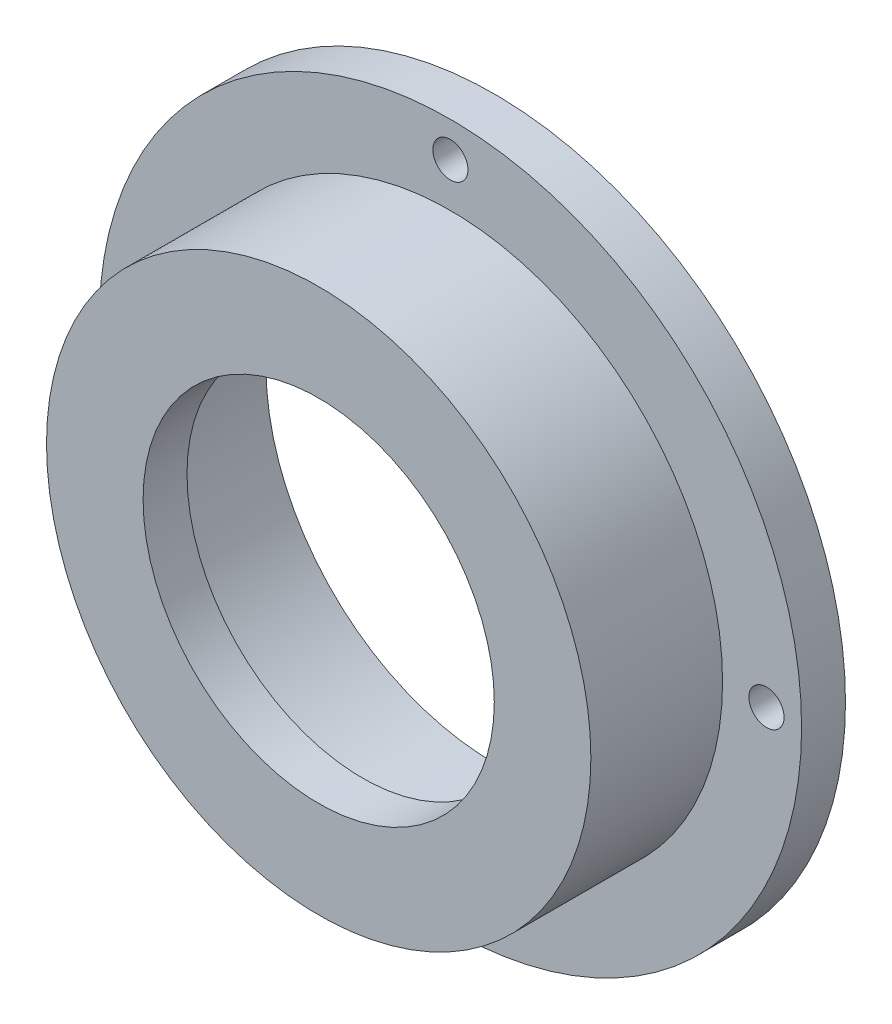
ISO-10303-21;
HEADER;
FILE_DESCRIPTION(('STEP AP214'),'2;1');
FILE_NAME('part.step','',(''),(''),'','','');
FILE_SCHEMA(('AUTOMOTIVE_DESIGN { 1 0 10303 214 1 1 1 1 }'));
ENDSEC;
DATA;
#1=APPLICATION_CONTEXT('core data for automotive mechanical design processes');
#2=APPLICATION_PROTOCOL_DEFINITION('international standard','automotive_design',2000,#1);
#3=PRODUCT_CONTEXT('',#1,'mechanical');
#4=PRODUCT('Part','Part','',(#3));
#5=PRODUCT_RELATED_PRODUCT_CATEGORY('part','',(#4));
#6=PRODUCT_DEFINITION_FORMATION('','',#4);
#7=PRODUCT_DEFINITION_CONTEXT('part definition',#1,'design');
#8=PRODUCT_DEFINITION('design','',#6,#7);
#9=PRODUCT_DEFINITION_SHAPE('','',#8);
#10=(LENGTH_UNIT() NAMED_UNIT(*) SI_UNIT(.MILLI.,.METRE.));
#11=(NAMED_UNIT(*) PLANE_ANGLE_UNIT() SI_UNIT($,.RADIAN.));
#12=(NAMED_UNIT(*) SI_UNIT($,.STERADIAN.) SOLID_ANGLE_UNIT());
#13=UNCERTAINTY_MEASURE_WITH_UNIT(LENGTH_MEASURE(1.E-05),#10,'distance_accuracy_value','');
#14=(GEOMETRIC_REPRESENTATION_CONTEXT(3) GLOBAL_UNCERTAINTY_ASSIGNED_CONTEXT((#13)) GLOBAL_UNIT_ASSIGNED_CONTEXT((#10,
#11,#12)) REPRESENTATION_CONTEXT('',''));
#15=CARTESIAN_POINT('',(0.,0.,0.));
#16=DIRECTION('',(0.,0.,1.));
#17=DIRECTION('',(1.,0.,0.));
#18=AXIS2_PLACEMENT_3D('',#15,#16,#17);
#19=CARTESIAN_POINT('',(0.,0.,5.));
#20=DIRECTION('',(0.,0.,-1.));
#21=DIRECTION('',(-1.,0.,0.));
#22=AXIS2_PLACEMENT_3D('',#19,#20,#21);
#23=CYLINDRICAL_SURFACE('',#22,40.);
#24=CARTESIAN_POINT('',(0.,0.,5.));
#25=DIRECTION('',(0.,0.,1.));
#26=DIRECTION('',(1.,0.,0.));
#27=AXIS2_PLACEMENT_3D('',#24,#25,#26);
#28=CIRCLE('',#27,40.);
#29=CARTESIAN_POINT('',(40.,0.,5.));
#30=VERTEX_POINT('',#29);
#31=EDGE_CURVE('E42',#30,#30,#28,.T.);
#32=ORIENTED_EDGE('',*,*,#31,.F.);
#33=EDGE_LOOP('',(#32));
#34=FACE_BOUND('',#33,.T.);
#35=CARTESIAN_POINT('',(0.,0.,0.));
#36=DIRECTION('',(0.,0.,1.));
#37=DIRECTION('',(1.,0.,0.));
#38=AXIS2_PLACEMENT_3D('',#35,#36,#37);
#39=CIRCLE('',#38,40.);
#40=CARTESIAN_POINT('',(40.,0.,0.));
#41=VERTEX_POINT('',#40);
#42=EDGE_CURVE('E38',#41,#41,#39,.T.);
#43=ORIENTED_EDGE('',*,*,#42,.T.);
#44=EDGE_LOOP('',(#43));
#45=FACE_BOUND('',#44,.T.);
#46=ADVANCED_FACE('F35',(#34,#45),#23,.T.);
#47=CARTESIAN_POINT('',(0.,0.,5.));
#48=DIRECTION('',(0.,0.,1.));
#49=DIRECTION('',(1.,0.,0.));
#50=AXIS2_PLACEMENT_3D('',#47,#48,#49);
#51=PLANE('',#50);
#52=CARTESIAN_POINT('',(36.,-1.25693328198353E-13,5.));
#53=DIRECTION('',(0.,0.,-1.));
#54=DIRECTION('',(0.,1.,0.));
#55=AXIS2_PLACEMENT_3D('',#52,#53,#54);
#56=CIRCLE('',#55,2.);
#57=CARTESIAN_POINT('',(36.,1.99999999999988,5.));
#58=VERTEX_POINT('',#57);
#59=EDGE_CURVE('E61',#58,#58,#56,.T.);
#60=ORIENTED_EDGE('',*,*,#59,.T.);
#61=EDGE_LOOP('',(#60));
#62=FACE_BOUND('',#61,.T.);
#63=CARTESIAN_POINT('',(0.,-36.,5.));
#64=DIRECTION('',(0.,0.,-1.));
#65=DIRECTION('',(1.,0.,0.));
#66=AXIS2_PLACEMENT_3D('',#63,#64,#65);
#67=CIRCLE('',#66,2.);
#68=CARTESIAN_POINT('',(2.,-36.,5.));
#69=VERTEX_POINT('',#68);
#70=EDGE_CURVE('E74',#69,#69,#67,.T.);
#71=ORIENTED_EDGE('',*,*,#70,.T.);
#72=EDGE_LOOP('',(#71));
#73=FACE_BOUND('',#72,.T.);
#74=CARTESIAN_POINT('',(-36.,3.77079984595058E-13,5.));
#75=DIRECTION('',(0.,0.,-1.));
#76=DIRECTION('',(0.,-1.,0.));
#77=AXIS2_PLACEMENT_3D('',#74,#75,#76);
#78=CIRCLE('',#77,2.);
#79=CARTESIAN_POINT('',(-36.,-1.99999999999963,5.));
#80=VERTEX_POINT('',#79);
#81=EDGE_CURVE('E67',#80,#80,#78,.T.);
#82=ORIENTED_EDGE('',*,*,#81,.T.);
#83=EDGE_LOOP('',(#82));
#84=FACE_BOUND('',#83,.T.);
#85=CARTESIAN_POINT('',(0.,36.,5.));
#86=DIRECTION('',(0.,0.,-1.));
#87=DIRECTION('',(-1.,0.,0.));
#88=AXIS2_PLACEMENT_3D('',#85,#86,#87);
#89=CIRCLE('',#88,2.);
#90=CARTESIAN_POINT('',(-2.,36.,5.));
#91=VERTEX_POINT('',#90);
#92=EDGE_CURVE('E57',#91,#91,#89,.T.);
#93=ORIENTED_EDGE('',*,*,#92,.T.);
#94=EDGE_LOOP('',(#93));
#95=FACE_BOUND('',#94,.T.);
#96=CARTESIAN_POINT('',(0.,0.,5.));
#97=DIRECTION('',(0.,0.,1.));
#98=DIRECTION('',(1.,0.,0.));
#99=AXIS2_PLACEMENT_3D('',#96,#97,#98);
#100=CIRCLE('',#99,31.);
#101=CARTESIAN_POINT('',(31.,0.,5.));
#102=VERTEX_POINT('',#101);
#103=EDGE_CURVE('E10',#102,#102,#100,.T.);
#104=ORIENTED_EDGE('',*,*,#103,.F.);
#105=EDGE_LOOP('',(#104));
#106=FACE_BOUND('',#105,.T.);
#107=ORIENTED_EDGE('',*,*,#31,.T.);
#108=EDGE_LOOP('',(#107));
#109=FACE_BOUND('',#108,.T.);
#110=ADVANCED_FACE('F109',(#62,#73,#84,#95,#106,#109),#51,.T.);
#111=CARTESIAN_POINT('',(0.,0.,0.));
#112=DIRECTION('',(0.,0.,1.));
#113=DIRECTION('',(1.,0.,0.));
#114=AXIS2_PLACEMENT_3D('',#111,#112,#113);
#115=PLANE('',#114);
#116=CARTESIAN_POINT('',(36.,-1.25693328198353E-13,0.));
#117=DIRECTION('',(0.,0.,-1.));
#118=DIRECTION('',(0.,1.,0.));
#119=AXIS2_PLACEMENT_3D('',#116,#117,#118);
#120=CIRCLE('',#119,2.);
#121=CARTESIAN_POINT('',(36.,1.99999999999988,0.));
#122=VERTEX_POINT('',#121);
#123=EDGE_CURVE('E77',#122,#122,#120,.T.);
#124=ORIENTED_EDGE('',*,*,#123,.F.);
#125=EDGE_LOOP('',(#124));
#126=FACE_BOUND('',#125,.T.);
#127=CARTESIAN_POINT('',(0.,-36.,0.));
#128=DIRECTION('',(0.,0.,-1.));
#129=DIRECTION('',(1.,0.,0.));
#130=AXIS2_PLACEMENT_3D('',#127,#128,#129);
#131=CIRCLE('',#130,2.);
#132=CARTESIAN_POINT('',(2.,-36.,0.));
#133=VERTEX_POINT('',#132);
#134=EDGE_CURVE('E71',#133,#133,#131,.T.);
#135=ORIENTED_EDGE('',*,*,#134,.F.);
#136=EDGE_LOOP('',(#135));
#137=FACE_BOUND('',#136,.T.);
#138=CARTESIAN_POINT('',(-36.,3.77079984595058E-13,0.));
#139=DIRECTION('',(0.,0.,-1.));
#140=DIRECTION('',(0.,-1.,0.));
#141=AXIS2_PLACEMENT_3D('',#138,#139,#140);
#142=CIRCLE('',#141,2.);
#143=CARTESIAN_POINT('',(-36.,-1.99999999999963,0.));
#144=VERTEX_POINT('',#143);
#145=EDGE_CURVE('E64',#144,#144,#142,.T.);
#146=ORIENTED_EDGE('',*,*,#145,.F.);
#147=EDGE_LOOP('',(#146));
#148=FACE_BOUND('',#147,.T.);
#149=CARTESIAN_POINT('',(0.,36.,0.));
#150=DIRECTION('',(0.,0.,-1.));
#151=DIRECTION('',(-1.,0.,0.));
#152=AXIS2_PLACEMENT_3D('',#149,#150,#151);
#153=CIRCLE('',#152,2.);
#154=CARTESIAN_POINT('',(-2.,36.,0.));
#155=VERTEX_POINT('',#154);
#156=EDGE_CURVE('E58',#155,#155,#153,.T.);
#157=ORIENTED_EDGE('',*,*,#156,.F.);
#158=EDGE_LOOP('',(#157));
#159=FACE_BOUND('',#158,.T.);
#160=CARTESIAN_POINT('',(0.,0.,0.));
#161=DIRECTION('',(0.,0.,-1.));
#162=DIRECTION('',(-1.,0.,0.));
#163=AXIS2_PLACEMENT_3D('',#160,#161,#162);
#164=CIRCLE('',#163,26.);
#165=CARTESIAN_POINT('',(-26.,0.,0.));
#166=VERTEX_POINT('',#165);
#167=EDGE_CURVE('E48',#166,#166,#164,.T.);
#168=ORIENTED_EDGE('',*,*,#167,.F.);
#169=EDGE_LOOP('',(#168));
#170=FACE_BOUND('',#169,.T.);
#171=ORIENTED_EDGE('',*,*,#42,.F.);
#172=EDGE_LOOP('',(#171));
#173=FACE_BOUND('',#172,.T.);
#174=ADVANCED_FACE('F101',(#126,#137,#148,#159,#170,#173),#115,.F.);
#175=CARTESIAN_POINT('',(0.,0.,17.));
#176=DIRECTION('',(0.,0.,-1.));
#177=DIRECTION('',(-1.,0.,0.));
#178=AXIS2_PLACEMENT_3D('',#175,#176,#177);
#179=CYLINDRICAL_SURFACE('',#178,31.);
#180=ORIENTED_EDGE('',*,*,#103,.T.);
#181=EDGE_LOOP('',(#180));
#182=FACE_BOUND('',#181,.T.);
#183=CARTESIAN_POINT('',(0.,0.,20.));
#184=DIRECTION('',(0.,0.,1.));
#185=DIRECTION('',(1.,0.,0.));
#186=AXIS2_PLACEMENT_3D('',#183,#184,#185);
#187=CIRCLE('',#186,31.);
#188=CARTESIAN_POINT('',(31.,0.,20.));
#189=VERTEX_POINT('',#188);
#190=EDGE_CURVE('E52',#189,#189,#187,.T.);
#191=ORIENTED_EDGE('',*,*,#190,.F.);
#192=EDGE_LOOP('',(#191));
#193=FACE_BOUND('',#192,.T.);
#194=ADVANCED_FACE('F98',(#182,#193),#179,.T.);
#195=CARTESIAN_POINT('',(0.,0.,15.));
#196=DIRECTION('',(0.,0.,-1.));
#197=DIRECTION('',(-1.,0.,0.));
#198=AXIS2_PLACEMENT_3D('',#195,#196,#197);
#199=CYLINDRICAL_SURFACE('',#198,26.);
#200=CARTESIAN_POINT('',(0.,0.,15.));
#201=DIRECTION('',(0.,0.,-1.));
#202=DIRECTION('',(-1.,0.,0.));
#203=AXIS2_PLACEMENT_3D('',#200,#201,#202);
#204=CIRCLE('',#203,26.);
#205=CARTESIAN_POINT('',(-26.,0.,15.));
#206=VERTEX_POINT('',#205);
#207=EDGE_CURVE('E51',#206,#206,#204,.T.);
#208=ORIENTED_EDGE('',*,*,#207,.F.);
#209=EDGE_LOOP('',(#208));
#210=FACE_BOUND('',#209,.T.);
#211=ORIENTED_EDGE('',*,*,#167,.T.);
#212=EDGE_LOOP('',(#211));
#213=FACE_BOUND('',#212,.T.);
#214=ADVANCED_FACE('F100',(#210,#213),#199,.F.);
#215=CARTESIAN_POINT('',(0.,0.,15.));
#216=DIRECTION('',(0.,0.,-1.));
#217=DIRECTION('',(-1.,0.,0.));
#218=AXIS2_PLACEMENT_3D('',#215,#216,#217);
#219=PLANE('',#218);
#220=CARTESIAN_POINT('',(0.,0.,15.));
#221=DIRECTION('',(0.,0.,-1.));
#222=DIRECTION('',(-1.,0.,0.));
#223=AXIS2_PLACEMENT_3D('',#220,#221,#222);
#224=CIRCLE('',#223,20.);
#225=CARTESIAN_POINT('',(-20.,0.,15.));
#226=VERTEX_POINT('',#225);
#227=EDGE_CURVE('E68',#226,#226,#224,.T.);
#228=ORIENTED_EDGE('',*,*,#227,.F.);
#229=EDGE_LOOP('',(#228));
#230=FACE_BOUND('',#229,.T.);
#231=ORIENTED_EDGE('',*,*,#207,.T.);
#232=EDGE_LOOP('',(#231));
#233=FACE_BOUND('',#232,.T.);
#234=ADVANCED_FACE('F94',(#230,#233),#219,.T.);
#235=CARTESIAN_POINT('',(0.,0.,20.));
#236=DIRECTION('',(0.,0.,1.));
#237=DIRECTION('',(1.,0.,0.));
#238=AXIS2_PLACEMENT_3D('',#235,#236,#237);
#239=PLANE('',#238);
#240=CARTESIAN_POINT('',(0.,0.,20.));
#241=DIRECTION('',(0.,0.,1.));
#242=DIRECTION('',(1.,0.,0.));
#243=AXIS2_PLACEMENT_3D('',#240,#241,#242);
#244=CIRCLE('',#243,20.);
#245=CARTESIAN_POINT('',(20.,0.,20.));
#246=VERTEX_POINT('',#245);
#247=EDGE_CURVE('E84',#246,#246,#244,.T.);
#248=ORIENTED_EDGE('',*,*,#247,.F.);
#249=EDGE_LOOP('',(#248));
#250=FACE_BOUND('',#249,.T.);
#251=ORIENTED_EDGE('',*,*,#190,.T.);
#252=EDGE_LOOP('',(#251));
#253=FACE_BOUND('',#252,.T.);
#254=ADVANCED_FACE('F90',(#250,#253),#239,.T.);
#255=CARTESIAN_POINT('',(0.,36.,5.));
#256=DIRECTION('',(0.,0.,-1.));
#257=DIRECTION('',(-1.,0.,0.));
#258=AXIS2_PLACEMENT_3D('',#255,#256,#257);
#259=CYLINDRICAL_SURFACE('',#258,2.);
#260=ORIENTED_EDGE('',*,*,#92,.F.);
#261=EDGE_LOOP('',(#260));
#262=FACE_BOUND('',#261,.T.);
#263=ORIENTED_EDGE('',*,*,#156,.T.);
#264=EDGE_LOOP('',(#263));
#265=FACE_BOUND('',#264,.T.);
#266=ADVANCED_FACE('F93',(#262,#265),#259,.F.);
#267=CARTESIAN_POINT('',(-36.,3.77079984595058E-13,5.));
#268=DIRECTION('',(0.,0.,-1.));
#269=DIRECTION('',(-1.,0.,0.));
#270=AXIS2_PLACEMENT_3D('',#267,#268,#269);
#271=CYLINDRICAL_SURFACE('',#270,2.);
#272=ORIENTED_EDGE('',*,*,#81,.F.);
#273=EDGE_LOOP('',(#272));
#274=FACE_BOUND('',#273,.T.);
#275=ORIENTED_EDGE('',*,*,#145,.T.);
#276=EDGE_LOOP('',(#275));
#277=FACE_BOUND('',#276,.T.);
#278=ADVANCED_FACE('F137',(#274,#277),#271,.F.);
#279=CARTESIAN_POINT('',(0.,-36.,5.));
#280=DIRECTION('',(0.,0.,-1.));
#281=DIRECTION('',(-1.,0.,0.));
#282=AXIS2_PLACEMENT_3D('',#279,#280,#281);
#283=CYLINDRICAL_SURFACE('',#282,2.);
#284=ORIENTED_EDGE('',*,*,#70,.F.);
#285=EDGE_LOOP('',(#284));
#286=FACE_BOUND('',#285,.T.);
#287=ORIENTED_EDGE('',*,*,#134,.T.);
#288=EDGE_LOOP('',(#287));
#289=FACE_BOUND('',#288,.T.);
#290=ADVANCED_FACE('F147',(#286,#289),#283,.F.);
#291=CARTESIAN_POINT('',(36.,-1.25693328198353E-13,5.));
#292=DIRECTION('',(0.,0.,-1.));
#293=DIRECTION('',(-1.,0.,0.));
#294=AXIS2_PLACEMENT_3D('',#291,#292,#293);
#295=CYLINDRICAL_SURFACE('',#294,2.);
#296=ORIENTED_EDGE('',*,*,#59,.F.);
#297=EDGE_LOOP('',(#296));
#298=FACE_BOUND('',#297,.T.);
#299=ORIENTED_EDGE('',*,*,#123,.T.);
#300=EDGE_LOOP('',(#299));
#301=FACE_BOUND('',#300,.T.);
#302=ADVANCED_FACE('F161',(#298,#301),#295,.F.);
#303=CARTESIAN_POINT('',(0.,0.,10.));
#304=DIRECTION('',(0.,0.,1.));
#305=DIRECTION('',(1.,0.,0.));
#306=AXIS2_PLACEMENT_3D('',#303,#304,#305);
#307=CYLINDRICAL_SURFACE('',#306,20.);
#308=ORIENTED_EDGE('',*,*,#227,.T.);
#309=EDGE_LOOP('',(#308));
#310=FACE_BOUND('',#309,.T.);
#311=ORIENTED_EDGE('',*,*,#247,.T.);
#312=EDGE_LOOP('',(#311));
#313=FACE_BOUND('',#312,.T.);
#314=ADVANCED_FACE('F88',(#310,#313),#307,.F.);
#315=CLOSED_SHELL('',(#46,#110,#174,#194,#214,#234,#254,#266,#278,#290,#302,#314));
#316=MANIFOLD_SOLID_BREP('B2',#315);
#317=ADVANCED_BREP_SHAPE_REPRESENTATION('',(#18,#316),#14);
#318=SHAPE_DEFINITION_REPRESENTATION(#9,#317);
ENDSEC;
END-ISO-10303-21;
